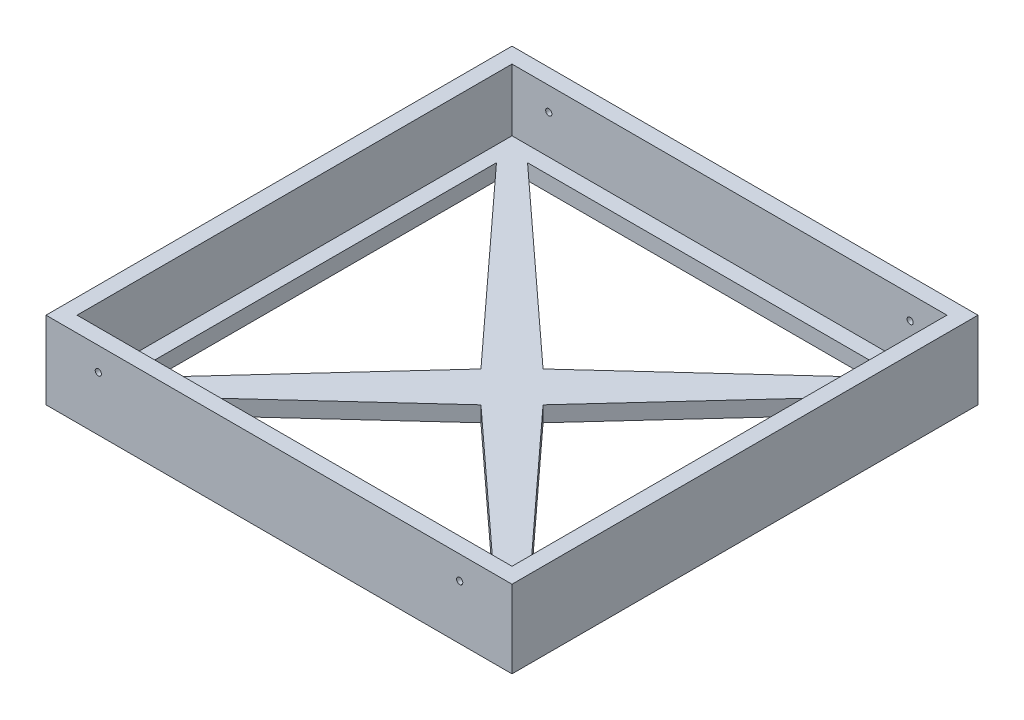
ISO-10303-21;
HEADER;
FILE_DESCRIPTION(('STEP AP214'),'2;1');
FILE_NAME('part.step','',(''),(''),'','','');
FILE_SCHEMA(('AUTOMOTIVE_DESIGN { 1 0 10303 214 1 1 1 1 }'));
ENDSEC;
DATA;
#1=APPLICATION_CONTEXT('core data for automotive mechanical design processes');
#2=APPLICATION_PROTOCOL_DEFINITION('international standard','automotive_design',2000,#1);
#3=PRODUCT_CONTEXT('',#1,'mechanical');
#4=PRODUCT('Part','Part','',(#3));
#5=PRODUCT_RELATED_PRODUCT_CATEGORY('part','',(#4));
#6=PRODUCT_DEFINITION_FORMATION('','',#4);
#7=PRODUCT_DEFINITION_CONTEXT('part definition',#1,'design');
#8=PRODUCT_DEFINITION('design','',#6,#7);
#9=PRODUCT_DEFINITION_SHAPE('','',#8);
#10=(LENGTH_UNIT() NAMED_UNIT(*) SI_UNIT(.MILLI.,.METRE.));
#11=(NAMED_UNIT(*) PLANE_ANGLE_UNIT() SI_UNIT($,.RADIAN.));
#12=(NAMED_UNIT(*) SI_UNIT($,.STERADIAN.) SOLID_ANGLE_UNIT());
#13=UNCERTAINTY_MEASURE_WITH_UNIT(LENGTH_MEASURE(1.E-05),#10,'distance_accuracy_value','');
#14=(GEOMETRIC_REPRESENTATION_CONTEXT(3) GLOBAL_UNCERTAINTY_ASSIGNED_CONTEXT((#13)) GLOBAL_UNIT_ASSIGNED_CONTEXT((#10,
#11,#12)) REPRESENTATION_CONTEXT('',''));
#15=CARTESIAN_POINT('',(0.,0.,0.));
#16=DIRECTION('',(0.,0.,1.));
#17=DIRECTION('',(1.,0.,0.));
#18=AXIS2_PLACEMENT_3D('',#15,#16,#17);
#19=CARTESIAN_POINT('',(-190.5,50.8,190.5));
#20=DIRECTION('',(0.,0.,-1.));
#21=DIRECTION('',(-1.,0.,0.));
#22=AXIS2_PLACEMENT_3D('',#19,#20,#21);
#23=PLANE('',#22);
#24=CARTESIAN_POINT('',(147.717881468527,31.75,190.5));
#25=DIRECTION('',(0.,0.,-1.));
#26=DIRECTION('',(-1.,0.,0.));
#27=AXIS2_PLACEMENT_3D('',#24,#25,#26);
#28=CIRCLE('',#27,2.53999999999998);
#29=CARTESIAN_POINT('',(145.177881468527,31.75,190.5));
#30=VERTEX_POINT('',#29);
#31=EDGE_CURVE('E424',#30,#30,#28,.T.);
#32=ORIENTED_EDGE('',*,*,#31,.T.);
#33=EDGE_LOOP('',(#32));
#34=FACE_BOUND('',#33,.T.);
#35=CARTESIAN_POINT('',(-147.717881468527,31.75,190.5));
#36=DIRECTION('',(0.,0.,1.));
#37=DIRECTION('',(1.,0.,0.));
#38=AXIS2_PLACEMENT_3D('',#35,#36,#37);
#39=CIRCLE('',#38,2.53999999999998);
#40=CARTESIAN_POINT('',(-145.177881468527,31.75,190.5));
#41=VERTEX_POINT('',#40);
#42=EDGE_CURVE('E432',#41,#41,#39,.T.);
#43=ORIENTED_EDGE('',*,*,#42,.F.);
#44=EDGE_LOOP('',(#43));
#45=FACE_BOUND('',#44,.T.);
#46=DIRECTION('',(0.,-1.,0.));
#47=VECTOR('',#46,1.);
#48=CARTESIAN_POINT('',(-190.5,50.8,190.5));
#49=LINE('',#48,#47);
#50=CARTESIAN_POINT('',(-190.5,50.8,190.5));
#51=VERTEX_POINT('',#50);
#52=CARTESIAN_POINT('',(-190.5,-12.7,190.5));
#53=VERTEX_POINT('',#52);
#54=EDGE_CURVE('E514',#51,#53,#49,.T.);
#55=ORIENTED_EDGE('',*,*,#54,.T.);
#56=DIRECTION('',(-1.,0.,0.));
#57=VECTOR('',#56,1.);
#58=CARTESIAN_POINT('',(-190.5,-12.7,190.5));
#59=LINE('',#58,#57);
#60=CARTESIAN_POINT('',(190.5,-12.7,190.5));
#61=VERTEX_POINT('',#60);
#62=EDGE_CURVE('E419',#61,#53,#59,.T.);
#63=ORIENTED_EDGE('',*,*,#62,.F.);
#64=DIRECTION('',(0.,-1.,0.));
#65=VECTOR('',#64,1.);
#66=CARTESIAN_POINT('',(190.5,50.8,190.5));
#67=LINE('',#66,#65);
#68=CARTESIAN_POINT('',(190.5,50.8,190.5));
#69=VERTEX_POINT('',#68);
#70=EDGE_CURVE('E12',#69,#61,#67,.T.);
#71=ORIENTED_EDGE('',*,*,#70,.F.);
#72=DIRECTION('',(1.,0.,0.));
#73=VECTOR('',#72,1.);
#74=CARTESIAN_POINT('',(-190.5,50.8,190.5));
#75=LINE('',#74,#73);
#76=EDGE_CURVE('E489',#51,#69,#75,.T.);
#77=ORIENTED_EDGE('',*,*,#76,.F.);
#78=EDGE_LOOP('',(#55,#63,#71,#77));
#79=FACE_BOUND('',#78,.T.);
#80=ADVANCED_FACE('F138',(#34,#45,#79),#23,.F.);
#81=CARTESIAN_POINT('',(190.5,50.8,-190.5));
#82=DIRECTION('',(1.,0.,0.));
#83=DIRECTION('',(0.,0.,-1.));
#84=AXIS2_PLACEMENT_3D('',#81,#82,#83);
#85=PLANE('',#84);
#86=ORIENTED_EDGE('',*,*,#70,.T.);
#87=DIRECTION('',(0.,0.,1.));
#88=VECTOR('',#87,1.);
#89=CARTESIAN_POINT('',(190.5,-12.7,190.5));
#90=LINE('',#89,#88);
#91=CARTESIAN_POINT('',(190.5,-12.7,-190.5));
#92=VERTEX_POINT('',#91);
#93=EDGE_CURVE('E415',#92,#61,#90,.T.);
#94=ORIENTED_EDGE('',*,*,#93,.F.);
#95=DIRECTION('',(0.,-1.,0.));
#96=VECTOR('',#95,1.);
#97=CARTESIAN_POINT('',(190.5,50.8,-190.5));
#98=LINE('',#97,#96);
#99=CARTESIAN_POINT('',(190.5,50.8,-190.5));
#100=VERTEX_POINT('',#99);
#101=EDGE_CURVE('E146',#100,#92,#98,.T.);
#102=ORIENTED_EDGE('',*,*,#101,.F.);
#103=DIRECTION('',(0.,0.,1.));
#104=VECTOR('',#103,1.);
#105=CARTESIAN_POINT('',(190.5,50.8,-190.5));
#106=LINE('',#105,#104);
#107=EDGE_CURVE('E503',#100,#69,#106,.T.);
#108=ORIENTED_EDGE('',*,*,#107,.T.);
#109=EDGE_LOOP('',(#86,#94,#102,#108));
#110=FACE_BOUND('',#109,.T.);
#111=ADVANCED_FACE('F531',(#110),#85,.T.);
#112=CARTESIAN_POINT('',(-190.5,50.8,-190.5));
#113=DIRECTION('',(0.,0.,-1.));
#114=DIRECTION('',(-1.,0.,0.));
#115=AXIS2_PLACEMENT_3D('',#112,#113,#114);
#116=PLANE('',#115);
#117=CARTESIAN_POINT('',(147.717881468527,31.75,-190.5));
#118=DIRECTION('',(0.,0.,-1.));
#119=DIRECTION('',(-1.,0.,0.));
#120=AXIS2_PLACEMENT_3D('',#117,#118,#119);
#121=CIRCLE('',#120,2.53999999999998);
#122=CARTESIAN_POINT('',(145.177881468527,31.75,-190.5));
#123=VERTEX_POINT('',#122);
#124=EDGE_CURVE('E440',#123,#123,#121,.T.);
#125=ORIENTED_EDGE('',*,*,#124,.F.);
#126=EDGE_LOOP('',(#125));
#127=FACE_BOUND('',#126,.T.);
#128=CARTESIAN_POINT('',(-147.717881468527,31.75,-190.5));
#129=DIRECTION('',(0.,0.,1.));
#130=DIRECTION('',(1.,0.,0.));
#131=AXIS2_PLACEMENT_3D('',#128,#129,#130);
#132=CIRCLE('',#131,2.53999999999998);
#133=CARTESIAN_POINT('',(-145.177881468527,31.75,-190.5));
#134=VERTEX_POINT('',#133);
#135=EDGE_CURVE('E448',#134,#134,#132,.T.);
#136=ORIENTED_EDGE('',*,*,#135,.T.);
#137=EDGE_LOOP('',(#136));
#138=FACE_BOUND('',#137,.T.);
#139=ORIENTED_EDGE('',*,*,#101,.T.);
#140=DIRECTION('',(1.,0.,0.));
#141=VECTOR('',#140,1.);
#142=CARTESIAN_POINT('',(-190.5,-12.7,-190.5));
#143=LINE('',#142,#141);
#144=CARTESIAN_POINT('',(-190.5,-12.7,-190.5));
#145=VERTEX_POINT('',#144);
#146=EDGE_CURVE('E411',#145,#92,#143,.T.);
#147=ORIENTED_EDGE('',*,*,#146,.F.);
#148=DIRECTION('',(0.,-1.,0.));
#149=VECTOR('',#148,1.);
#150=CARTESIAN_POINT('',(-190.5,50.8,-190.5));
#151=LINE('',#150,#149);
#152=CARTESIAN_POINT('',(-190.5,50.8,-190.5));
#153=VERTEX_POINT('',#152);
#154=EDGE_CURVE('E517',#153,#145,#151,.T.);
#155=ORIENTED_EDGE('',*,*,#154,.F.);
#156=DIRECTION('',(1.,0.,0.));
#157=VECTOR('',#156,1.);
#158=CARTESIAN_POINT('',(-190.5,50.8,-190.5));
#159=LINE('',#158,#157);
#160=EDGE_CURVE('E507',#153,#100,#159,.T.);
#161=ORIENTED_EDGE('',*,*,#160,.T.);
#162=EDGE_LOOP('',(#139,#147,#155,#161));
#163=FACE_BOUND('',#162,.T.);
#164=ADVANCED_FACE('F522',(#127,#138,#163),#116,.T.);
#165=CARTESIAN_POINT('',(-190.5,50.8,-190.5));
#166=DIRECTION('',(1.,0.,0.));
#167=DIRECTION('',(0.,0.,-1.));
#168=AXIS2_PLACEMENT_3D('',#165,#166,#167);
#169=PLANE('',#168);
#170=ORIENTED_EDGE('',*,*,#154,.T.);
#171=DIRECTION('',(0.,0.,-1.));
#172=VECTOR('',#171,1.);
#173=CARTESIAN_POINT('',(-190.5,-12.7,190.5));
#174=LINE('',#173,#172);
#175=EDGE_CURVE('E401',#53,#145,#174,.T.);
#176=ORIENTED_EDGE('',*,*,#175,.F.);
#177=ORIENTED_EDGE('',*,*,#54,.F.);
#178=DIRECTION('',(0.,0.,1.));
#179=VECTOR('',#178,1.);
#180=CARTESIAN_POINT('',(-190.5,50.8,-190.5));
#181=LINE('',#180,#179);
#182=EDGE_CURVE('E511',#153,#51,#181,.T.);
#183=ORIENTED_EDGE('',*,*,#182,.F.);
#184=EDGE_LOOP('',(#170,#176,#177,#183));
#185=FACE_BOUND('',#184,.T.);
#186=ADVANCED_FACE('F537',(#185),#169,.F.);
#187=CARTESIAN_POINT('',(0.,50.8,0.));
#188=DIRECTION('',(0.,-1.,0.));
#189=DIRECTION('',(0.,0.,-1.));
#190=AXIS2_PLACEMENT_3D('',#187,#188,#189);
#191=PLANE('',#190);
#192=DIRECTION('',(0.,0.,1.));
#193=VECTOR('',#192,1.);
#194=CARTESIAN_POINT('',(-177.8,50.8,-177.8));
#195=LINE('',#194,#193);
#196=CARTESIAN_POINT('',(-177.8,50.8,-177.8));
#197=VERTEX_POINT('',#196);
#198=CARTESIAN_POINT('',(-177.8,50.8,177.8));
#199=VERTEX_POINT('',#198);
#200=EDGE_CURVE('E469',#197,#199,#195,.T.);
#201=ORIENTED_EDGE('',*,*,#200,.F.);
#202=DIRECTION('',(1.,0.,0.));
#203=VECTOR('',#202,1.);
#204=CARTESIAN_POINT('',(-177.8,50.8,-177.8));
#205=LINE('',#204,#203);
#206=CARTESIAN_POINT('',(177.8,50.8,-177.8));
#207=VERTEX_POINT('',#206);
#208=EDGE_CURVE('E456',#197,#207,#205,.T.);
#209=ORIENTED_EDGE('',*,*,#208,.T.);
#210=DIRECTION('',(0.,0.,1.));
#211=VECTOR('',#210,1.);
#212=CARTESIAN_POINT('',(177.8,50.8,-177.8));
#213=LINE('',#212,#211);
#214=CARTESIAN_POINT('',(177.8,50.8,177.8));
#215=VERTEX_POINT('',#214);
#216=EDGE_CURVE('E460',#207,#215,#213,.T.);
#217=ORIENTED_EDGE('',*,*,#216,.T.);
#218=DIRECTION('',(1.,0.,0.));
#219=VECTOR('',#218,1.);
#220=CARTESIAN_POINT('',(-177.8,50.8,177.8));
#221=LINE('',#220,#219);
#222=EDGE_CURVE('E465',#199,#215,#221,.T.);
#223=ORIENTED_EDGE('',*,*,#222,.F.);
#224=EDGE_LOOP('',(#201,#209,#217,#223));
#225=FACE_BOUND('',#224,.T.);
#226=ORIENTED_EDGE('',*,*,#76,.T.);
#227=ORIENTED_EDGE('',*,*,#107,.F.);
#228=ORIENTED_EDGE('',*,*,#160,.F.);
#229=ORIENTED_EDGE('',*,*,#182,.T.);
#230=EDGE_LOOP('',(#226,#227,#228,#229));
#231=FACE_BOUND('',#230,.T.);
#232=ADVANCED_FACE('F540',(#225,#231),#191,.F.);
#233=CARTESIAN_POINT('',(-177.8,50.8,-177.8));
#234=DIRECTION('',(0.,0.,-1.));
#235=DIRECTION('',(-1.,0.,0.));
#236=AXIS2_PLACEMENT_3D('',#233,#234,#235);
#237=PLANE('',#236);
#238=CARTESIAN_POINT('',(147.717881468527,31.75,-177.8));
#239=DIRECTION('',(0.,0.,-1.));
#240=DIRECTION('',(-1.,0.,0.));
#241=AXIS2_PLACEMENT_3D('',#238,#239,#240);
#242=CIRCLE('',#241,2.53999999999998);
#243=CARTESIAN_POINT('',(145.177881468527,31.75,-177.8));
#244=VERTEX_POINT('',#243);
#245=EDGE_CURVE('E436',#244,#244,#242,.T.);
#246=ORIENTED_EDGE('',*,*,#245,.T.);
#247=EDGE_LOOP('',(#246));
#248=FACE_BOUND('',#247,.T.);
#249=CARTESIAN_POINT('',(-147.717881468527,31.75,-177.8));
#250=DIRECTION('',(0.,0.,1.));
#251=DIRECTION('',(1.,0.,0.));
#252=AXIS2_PLACEMENT_3D('',#249,#250,#251);
#253=CIRCLE('',#252,2.53999999999998);
#254=CARTESIAN_POINT('',(-145.177881468527,31.75,-177.8));
#255=VERTEX_POINT('',#254);
#256=EDGE_CURVE('E444',#255,#255,#253,.T.);
#257=ORIENTED_EDGE('',*,*,#256,.F.);
#258=EDGE_LOOP('',(#257));
#259=FACE_BOUND('',#258,.T.);
#260=DIRECTION('',(1.,0.,0.));
#261=VECTOR('',#260,1.);
#262=CARTESIAN_POINT('',(-177.8,0.,-177.8));
#263=LINE('',#262,#261);
#264=CARTESIAN_POINT('',(-177.8,0.,-177.8));
#265=VERTEX_POINT('',#264);
#266=CARTESIAN_POINT('',(177.8,0.,-177.8));
#267=VERTEX_POINT('',#266);
#268=EDGE_CURVE('E452',#265,#267,#263,.T.);
#269=ORIENTED_EDGE('',*,*,#268,.T.);
#270=DIRECTION('',(0.,-1.,0.));
#271=VECTOR('',#270,1.);
#272=CARTESIAN_POINT('',(177.8,50.8,-177.8));
#273=LINE('',#272,#271);
#274=EDGE_CURVE('E472',#207,#267,#273,.T.);
#275=ORIENTED_EDGE('',*,*,#274,.F.);
#276=ORIENTED_EDGE('',*,*,#208,.F.);
#277=DIRECTION('',(0.,-1.,0.));
#278=VECTOR('',#277,1.);
#279=CARTESIAN_POINT('',(-177.8,50.8,-177.8));
#280=LINE('',#279,#278);
#281=EDGE_CURVE('E485',#197,#265,#280,.T.);
#282=ORIENTED_EDGE('',*,*,#281,.T.);
#283=EDGE_LOOP('',(#269,#275,#276,#282));
#284=FACE_BOUND('',#283,.T.);
#285=ADVANCED_FACE('F542',(#248,#259,#284),#237,.F.);
#286=CARTESIAN_POINT('',(-177.8,50.8,-177.8));
#287=DIRECTION('',(1.,0.,0.));
#288=DIRECTION('',(0.,0.,-1.));
#289=AXIS2_PLACEMENT_3D('',#286,#287,#288);
#290=PLANE('',#289);
#291=DIRECTION('',(0.,0.,1.));
#292=VECTOR('',#291,1.);
#293=CARTESIAN_POINT('',(-177.8,0.,-177.8));
#294=LINE('',#293,#292);
#295=CARTESIAN_POINT('',(-177.8,0.,177.8));
#296=VERTEX_POINT('',#295);
#297=EDGE_CURVE('E461',#265,#296,#294,.T.);
#298=ORIENTED_EDGE('',*,*,#297,.F.);
#299=ORIENTED_EDGE('',*,*,#281,.F.);
#300=ORIENTED_EDGE('',*,*,#200,.T.);
#301=DIRECTION('',(0.,-1.,0.));
#302=VECTOR('',#301,1.);
#303=CARTESIAN_POINT('',(-177.8,50.8,177.8));
#304=LINE('',#303,#302);
#305=EDGE_CURVE('E490',#199,#296,#304,.T.);
#306=ORIENTED_EDGE('',*,*,#305,.T.);
#307=EDGE_LOOP('',(#298,#299,#300,#306));
#308=FACE_BOUND('',#307,.T.);
#309=ADVANCED_FACE('F549',(#308),#290,.T.);
#310=CARTESIAN_POINT('',(-177.8,50.8,177.8));
#311=DIRECTION('',(0.,0.,-1.));
#312=DIRECTION('',(-1.,0.,0.));
#313=AXIS2_PLACEMENT_3D('',#310,#311,#312);
#314=PLANE('',#313);
#315=CARTESIAN_POINT('',(147.717881468527,31.75,177.8));
#316=DIRECTION('',(0.,0.,-1.));
#317=DIRECTION('',(-1.,0.,0.));
#318=AXIS2_PLACEMENT_3D('',#315,#316,#317);
#319=CIRCLE('',#318,2.53999999999998);
#320=CARTESIAN_POINT('',(145.177881468527,31.75,177.8));
#321=VERTEX_POINT('',#320);
#322=EDGE_CURVE('E423',#321,#321,#319,.T.);
#323=ORIENTED_EDGE('',*,*,#322,.F.);
#324=EDGE_LOOP('',(#323));
#325=FACE_BOUND('',#324,.T.);
#326=CARTESIAN_POINT('',(-147.717881468527,31.75,177.8));
#327=DIRECTION('',(0.,0.,1.));
#328=DIRECTION('',(1.,0.,0.));
#329=AXIS2_PLACEMENT_3D('',#326,#327,#328);
#330=CIRCLE('',#329,2.53999999999998);
#331=CARTESIAN_POINT('',(-145.177881468527,31.75,177.8));
#332=VERTEX_POINT('',#331);
#333=EDGE_CURVE('E428',#332,#332,#330,.T.);
#334=ORIENTED_EDGE('',*,*,#333,.T.);
#335=EDGE_LOOP('',(#334));
#336=FACE_BOUND('',#335,.T.);
#337=DIRECTION('',(1.,0.,0.));
#338=VECTOR('',#337,1.);
#339=CARTESIAN_POINT('',(-177.8,0.,177.8));
#340=LINE('',#339,#338);
#341=CARTESIAN_POINT('',(177.8,0.,177.8));
#342=VERTEX_POINT('',#341);
#343=EDGE_CURVE('E480',#296,#342,#340,.T.);
#344=ORIENTED_EDGE('',*,*,#343,.F.);
#345=ORIENTED_EDGE('',*,*,#305,.F.);
#346=ORIENTED_EDGE('',*,*,#222,.T.);
#347=DIRECTION('',(0.,-1.,0.));
#348=VECTOR('',#347,1.);
#349=CARTESIAN_POINT('',(177.8,50.8,177.8));
#350=LINE('',#349,#348);
#351=EDGE_CURVE('E494',#215,#342,#350,.T.);
#352=ORIENTED_EDGE('',*,*,#351,.T.);
#353=EDGE_LOOP('',(#344,#345,#346,#352));
#354=FACE_BOUND('',#353,.T.);
#355=ADVANCED_FACE('F571',(#325,#336,#354),#314,.T.);
#356=CARTESIAN_POINT('',(177.8,50.8,-177.8));
#357=DIRECTION('',(1.,0.,0.));
#358=DIRECTION('',(0.,0.,-1.));
#359=AXIS2_PLACEMENT_3D('',#356,#357,#358);
#360=PLANE('',#359);
#361=DIRECTION('',(0.,0.,1.));
#362=VECTOR('',#361,1.);
#363=CARTESIAN_POINT('',(177.8,0.,-177.8));
#364=LINE('',#363,#362);
#365=EDGE_CURVE('E476',#267,#342,#364,.T.);
#366=ORIENTED_EDGE('',*,*,#365,.T.);
#367=ORIENTED_EDGE('',*,*,#351,.F.);
#368=ORIENTED_EDGE('',*,*,#216,.F.);
#369=ORIENTED_EDGE('',*,*,#274,.T.);
#370=EDGE_LOOP('',(#366,#367,#368,#369));
#371=FACE_BOUND('',#370,.T.);
#372=ADVANCED_FACE('F574',(#371),#360,.F.);
#373=CARTESIAN_POINT('',(-147.717881468527,31.75,-190.5));
#374=DIRECTION('',(0.,0.,1.));
#375=DIRECTION('',(1.,0.,0.));
#376=AXIS2_PLACEMENT_3D('',#373,#374,#375);
#377=CYLINDRICAL_SURFACE('',#376,2.53999999999998);
#378=ORIENTED_EDGE('',*,*,#135,.F.);
#379=EDGE_LOOP('',(#378));
#380=FACE_BOUND('',#379,.T.);
#381=ORIENTED_EDGE('',*,*,#256,.T.);
#382=EDGE_LOOP('',(#381));
#383=FACE_BOUND('',#382,.T.);
#384=ADVANCED_FACE('F588',(#380,#383),#377,.F.);
#385=CARTESIAN_POINT('',(147.717881468527,31.75,-190.5));
#386=DIRECTION('',(0.,0.,1.));
#387=DIRECTION('',(1.,0.,0.));
#388=AXIS2_PLACEMENT_3D('',#385,#386,#387);
#389=CYLINDRICAL_SURFACE('',#388,2.53999999999998);
#390=ORIENTED_EDGE('',*,*,#124,.T.);
#391=EDGE_LOOP('',(#390));
#392=FACE_BOUND('',#391,.T.);
#393=ORIENTED_EDGE('',*,*,#245,.F.);
#394=EDGE_LOOP('',(#393));
#395=FACE_BOUND('',#394,.T.);
#396=ADVANCED_FACE('F567',(#392,#395),#389,.F.);
#397=CARTESIAN_POINT('',(-147.717881468527,31.75,190.5));
#398=DIRECTION('',(0.,0.,-1.));
#399=DIRECTION('',(-1.,0.,0.));
#400=AXIS2_PLACEMENT_3D('',#397,#398,#399);
#401=CYLINDRICAL_SURFACE('',#400,2.53999999999998);
#402=ORIENTED_EDGE('',*,*,#42,.T.);
#403=EDGE_LOOP('',(#402));
#404=FACE_BOUND('',#403,.T.);
#405=ORIENTED_EDGE('',*,*,#333,.F.);
#406=EDGE_LOOP('',(#405));
#407=FACE_BOUND('',#406,.T.);
#408=ADVANCED_FACE('F563',(#404,#407),#401,.F.);
#409=CARTESIAN_POINT('',(147.717881468527,31.75,190.5));
#410=DIRECTION('',(0.,0.,-1.));
#411=DIRECTION('',(-1.,0.,0.));
#412=AXIS2_PLACEMENT_3D('',#409,#410,#411);
#413=CYLINDRICAL_SURFACE('',#412,2.53999999999998);
#414=ORIENTED_EDGE('',*,*,#31,.F.);
#415=EDGE_LOOP('',(#414));
#416=FACE_BOUND('',#415,.T.);
#417=ORIENTED_EDGE('',*,*,#322,.T.);
#418=EDGE_LOOP('',(#417));
#419=FACE_BOUND('',#418,.T.);
#420=ADVANCED_FACE('F566',(#416,#419),#413,.F.);
#421=CARTESIAN_POINT('',(0.,0.,0.));
#422=DIRECTION('',(0.,-1.,0.));
#423=DIRECTION('',(0.,0.,-1.));
#424=AXIS2_PLACEMENT_3D('',#421,#422,#423);
#425=PLANE('',#424);
#426=DIRECTION('',(-0.675724628517344,0.,-0.737154140200744));
#427=VECTOR('',#426,1.);
#428=CARTESIAN_POINT('',(165.1,0.,152.400000000001));
#429=LINE('',#428,#427);
#430=CARTESIAN_POINT('',(165.1,0.,152.400000000001));
#431=VERTEX_POINT('',#430);
#432=CARTESIAN_POINT('',(25.4,0.,0.));
#433=VERTEX_POINT('',#432);
#434=EDGE_CURVE('E329',#431,#433,#429,.T.);
#435=ORIENTED_EDGE('',*,*,#434,.T.);
#436=DIRECTION('',(-0.675724628517349,0.,0.737154140200739));
#437=VECTOR('',#436,1.);
#438=CARTESIAN_POINT('',(165.100000000001,0.,-152.399999999999));
#439=LINE('',#438,#437);
#440=CARTESIAN_POINT('',(165.100000000001,0.,-152.399999999999));
#441=VERTEX_POINT('',#440);
#442=EDGE_CURVE('E153',#441,#433,#439,.T.);
#443=ORIENTED_EDGE('',*,*,#442,.F.);
#444=DIRECTION('',(0.,0.,1.));
#445=VECTOR('',#444,1.);
#446=CARTESIAN_POINT('',(165.100000000001,0.,-152.399999999999));
#447=LINE('',#446,#445);
#448=EDGE_CURVE('E325',#441,#431,#447,.T.);
#449=ORIENTED_EDGE('',*,*,#448,.T.);
#450=EDGE_LOOP('',(#435,#443,#449));
#451=FACE_BOUND('',#450,.T.);
#452=DIRECTION('',(-0.737154140200741,0.,0.675724628517346));
#453=VECTOR('',#452,1.);
#454=CARTESIAN_POINT('',(152.4,0.,-165.1));
#455=LINE('',#454,#453);
#456=CARTESIAN_POINT('',(152.4,0.,-165.1));
#457=VERTEX_POINT('',#456);
#458=CARTESIAN_POINT('',(0.,0.,-25.4));
#459=VERTEX_POINT('',#458);
#460=EDGE_CURVE('E359',#457,#459,#455,.T.);
#461=ORIENTED_EDGE('',*,*,#460,.T.);
#462=DIRECTION('',(0.737154140200741,0.,0.675724628517346));
#463=VECTOR('',#462,1.);
#464=CARTESIAN_POINT('',(-152.4,0.,-165.1));
#465=LINE('',#464,#463);
#466=CARTESIAN_POINT('',(-152.4,0.,-165.1));
#467=VERTEX_POINT('',#466);
#468=EDGE_CURVE('E161',#467,#459,#465,.T.);
#469=ORIENTED_EDGE('',*,*,#468,.F.);
#470=DIRECTION('',(1.,0.,0.));
#471=VECTOR('',#470,1.);
#472=CARTESIAN_POINT('',(-152.4,0.,-165.1));
#473=LINE('',#472,#471);
#474=EDGE_CURVE('E355',#467,#457,#473,.T.);
#475=ORIENTED_EDGE('',*,*,#474,.T.);
#476=EDGE_LOOP('',(#461,#469,#475));
#477=FACE_BOUND('',#476,.T.);
#478=DIRECTION('',(0.737154140200746,0.,-0.675724628517341));
#479=VECTOR('',#478,1.);
#480=CARTESIAN_POINT('',(-152.400000000001,0.,165.099999999999));
#481=LINE('',#480,#479);
#482=CARTESIAN_POINT('',(-152.400000000001,0.,165.099999999999));
#483=VERTEX_POINT('',#482);
#484=CARTESIAN_POINT('',(-1.78676518025611E-13,0.,25.4));
#485=VERTEX_POINT('',#484);
#486=EDGE_CURVE('E297',#483,#485,#481,.T.);
#487=ORIENTED_EDGE('',*,*,#486,.T.);
#488=DIRECTION('',(-0.737154140200737,0.,-0.675724628517351));
#489=VECTOR('',#488,1.);
#490=CARTESIAN_POINT('',(152.399999999999,0.,165.100000000001));
#491=LINE('',#490,#489);
#492=CARTESIAN_POINT('',(152.399999999999,0.,165.100000000001));
#493=VERTEX_POINT('',#492);
#494=EDGE_CURVE('E280',#493,#485,#491,.T.);
#495=ORIENTED_EDGE('',*,*,#494,.F.);
#496=DIRECTION('',(-1.,0.,0.));
#497=VECTOR('',#496,1.);
#498=CARTESIAN_POINT('',(152.399999999999,0.,165.100000000001));
#499=LINE('',#498,#497);
#500=EDGE_CURVE('E291',#493,#483,#499,.T.);
#501=ORIENTED_EDGE('',*,*,#500,.T.);
#502=EDGE_LOOP('',(#487,#495,#501));
#503=FACE_BOUND('',#502,.T.);
#504=DIRECTION('',(0.675724628517338,0.,0.737154140200749));
#505=VECTOR('',#504,1.);
#506=CARTESIAN_POINT('',(-165.099999999998,0.,-152.400000000002));
#507=LINE('',#506,#505);
#508=CARTESIAN_POINT('',(-165.099999999998,0.,-152.400000000002));
#509=VERTEX_POINT('',#508);
#510=CARTESIAN_POINT('',(-25.4,0.,-2.65412691824451E-13));
#511=VERTEX_POINT('',#510);
#512=EDGE_CURVE('E391',#509,#511,#507,.T.);
#513=ORIENTED_EDGE('',*,*,#512,.T.);
#514=DIRECTION('',(0.675724628517354,0.,-0.737154140200734));
#515=VECTOR('',#514,1.);
#516=CARTESIAN_POINT('',(-165.100000000002,0.,152.399999999998));
#517=LINE('',#516,#515);
#518=CARTESIAN_POINT('',(-165.100000000002,0.,152.399999999998));
#519=VERTEX_POINT('',#518);
#520=EDGE_CURVE('E366',#519,#511,#517,.T.);
#521=ORIENTED_EDGE('',*,*,#520,.F.);
#522=DIRECTION('',(0.,0.,-1.));
#523=VECTOR('',#522,1.);
#524=CARTESIAN_POINT('',(-165.100000000002,0.,152.399999999998));
#525=LINE('',#524,#523);
#526=EDGE_CURVE('E381',#519,#509,#525,.T.);
#527=ORIENTED_EDGE('',*,*,#526,.T.);
#528=EDGE_LOOP('',(#513,#521,#527));
#529=FACE_BOUND('',#528,.T.);
#530=ORIENTED_EDGE('',*,*,#268,.F.);
#531=ORIENTED_EDGE('',*,*,#297,.T.);
#532=ORIENTED_EDGE('',*,*,#343,.T.);
#533=ORIENTED_EDGE('',*,*,#365,.F.);
#534=EDGE_LOOP('',(#530,#531,#532,#533));
#535=FACE_BOUND('',#534,.T.);
#536=ADVANCED_FACE('F299',(#451,#477,#503,#529,#535),#425,.F.);
#537=CARTESIAN_POINT('',(0.,-12.7,0.));
#538=DIRECTION('',(0.,-1.,0.));
#539=DIRECTION('',(0.,0.,-1.));
#540=AXIS2_PLACEMENT_3D('',#537,#538,#539);
#541=PLANE('',#540);
#542=DIRECTION('',(-0.675724628517349,0.,0.737154140200739));
#543=VECTOR('',#542,1.);
#544=CARTESIAN_POINT('',(165.100000000001,-12.7,-152.399999999999));
#545=LINE('',#544,#543);
#546=CARTESIAN_POINT('',(165.100000000001,-12.7,-152.399999999999));
#547=VERTEX_POINT('',#546);
#548=CARTESIAN_POINT('',(25.4,-12.7,0.));
#549=VERTEX_POINT('',#548);
#550=EDGE_CURVE('E330',#547,#549,#545,.T.);
#551=ORIENTED_EDGE('',*,*,#550,.T.);
#552=DIRECTION('',(-0.675724628517344,0.,-0.737154140200744));
#553=VECTOR('',#552,1.);
#554=CARTESIAN_POINT('',(165.1,-12.7,152.400000000001));
#555=LINE('',#554,#553);
#556=CARTESIAN_POINT('',(165.1,-12.7,152.400000000001));
#557=VERTEX_POINT('',#556);
#558=EDGE_CURVE('E340',#557,#549,#555,.T.);
#559=ORIENTED_EDGE('',*,*,#558,.F.);
#560=DIRECTION('',(0.,0.,1.));
#561=VECTOR('',#560,1.);
#562=CARTESIAN_POINT('',(165.100000000001,-12.7,-152.399999999999));
#563=LINE('',#562,#561);
#564=EDGE_CURVE('E322',#547,#557,#563,.T.);
#565=ORIENTED_EDGE('',*,*,#564,.F.);
#566=EDGE_LOOP('',(#551,#559,#565));
#567=FACE_BOUND('',#566,.T.);
#568=DIRECTION('',(0.737154140200741,0.,0.675724628517346));
#569=VECTOR('',#568,1.);
#570=CARTESIAN_POINT('',(-152.4,-12.7,-165.1));
#571=LINE('',#570,#569);
#572=CARTESIAN_POINT('',(-152.4,-12.7,-165.1));
#573=VERTEX_POINT('',#572);
#574=CARTESIAN_POINT('',(0.,-12.7,-25.4));
#575=VERTEX_POINT('',#574);
#576=EDGE_CURVE('E360',#573,#575,#571,.T.);
#577=ORIENTED_EDGE('',*,*,#576,.T.);
#578=DIRECTION('',(-0.737154140200741,0.,0.675724628517346));
#579=VECTOR('',#578,1.);
#580=CARTESIAN_POINT('',(152.4,-12.7,-165.1));
#581=LINE('',#580,#579);
#582=CARTESIAN_POINT('',(152.4,-12.7,-165.1));
#583=VERTEX_POINT('',#582);
#584=EDGE_CURVE('E370',#583,#575,#581,.T.);
#585=ORIENTED_EDGE('',*,*,#584,.F.);
#586=DIRECTION('',(1.,0.,0.));
#587=VECTOR('',#586,1.);
#588=CARTESIAN_POINT('',(-152.4,-12.7,-165.1));
#589=LINE('',#588,#587);
#590=EDGE_CURVE('E349',#573,#583,#589,.T.);
#591=ORIENTED_EDGE('',*,*,#590,.F.);
#592=EDGE_LOOP('',(#577,#585,#591));
#593=FACE_BOUND('',#592,.T.);
#594=DIRECTION('',(-0.737154140200737,0.,-0.675724628517351));
#595=VECTOR('',#594,1.);
#596=CARTESIAN_POINT('',(152.399999999999,-12.7,165.100000000001));
#597=LINE('',#596,#595);
#598=CARTESIAN_POINT('',(152.399999999999,-12.7,165.100000000001));
#599=VERTEX_POINT('',#598);
#600=CARTESIAN_POINT('',(-1.77367252013231E-13,-12.7,25.4));
#601=VERTEX_POINT('',#600);
#602=EDGE_CURVE('E283',#599,#601,#597,.T.);
#603=ORIENTED_EDGE('',*,*,#602,.T.);
#604=DIRECTION('',(0.737154140200746,0.,-0.675724628517341));
#605=VECTOR('',#604,1.);
#606=CARTESIAN_POINT('',(-152.400000000001,-12.7,165.099999999999));
#607=LINE('',#606,#605);
#608=CARTESIAN_POINT('',(-152.400000000001,-12.7,165.099999999999));
#609=VERTEX_POINT('',#608);
#610=EDGE_CURVE('E313',#609,#601,#607,.T.);
#611=ORIENTED_EDGE('',*,*,#610,.F.);
#612=DIRECTION('',(-1.,0.,0.));
#613=VECTOR('',#612,1.);
#614=CARTESIAN_POINT('',(152.399999999999,-12.7,165.100000000001));
#615=LINE('',#614,#613);
#616=EDGE_CURVE('E310',#599,#609,#615,.T.);
#617=ORIENTED_EDGE('',*,*,#616,.F.);
#618=EDGE_LOOP('',(#603,#611,#617));
#619=FACE_BOUND('',#618,.T.);
#620=DIRECTION('',(0.675724628517354,0.,-0.737154140200734));
#621=VECTOR('',#620,1.);
#622=CARTESIAN_POINT('',(-165.100000000002,-12.7,152.399999999998));
#623=LINE('',#622,#621);
#624=CARTESIAN_POINT('',(-165.100000000002,-12.7,152.399999999998));
#625=VERTEX_POINT('',#624);
#626=CARTESIAN_POINT('',(-25.4,-12.7,-2.66050878019847E-13));
#627=VERTEX_POINT('',#626);
#628=EDGE_CURVE('E376',#625,#627,#623,.T.);
#629=ORIENTED_EDGE('',*,*,#628,.T.);
#630=DIRECTION('',(0.675724628517338,0.,0.737154140200749));
#631=VECTOR('',#630,1.);
#632=CARTESIAN_POINT('',(-165.099999999998,-12.7,-152.400000000002));
#633=LINE('',#632,#631);
#634=CARTESIAN_POINT('',(-165.099999999998,-12.7,-152.400000000002));
#635=VERTEX_POINT('',#634);
#636=EDGE_CURVE('E380',#635,#627,#633,.T.);
#637=ORIENTED_EDGE('',*,*,#636,.F.);
#638=DIRECTION('',(0.,0.,-1.));
#639=VECTOR('',#638,1.);
#640=CARTESIAN_POINT('',(-165.100000000002,-12.7,152.399999999998));
#641=LINE('',#640,#639);
#642=EDGE_CURVE('E384',#625,#635,#641,.T.);
#643=ORIENTED_EDGE('',*,*,#642,.F.);
#644=EDGE_LOOP('',(#629,#637,#643));
#645=FACE_BOUND('',#644,.T.);
#646=ORIENTED_EDGE('',*,*,#175,.T.);
#647=ORIENTED_EDGE('',*,*,#146,.T.);
#648=ORIENTED_EDGE('',*,*,#93,.T.);
#649=ORIENTED_EDGE('',*,*,#62,.T.);
#650=EDGE_LOOP('',(#646,#647,#648,#649));
#651=FACE_BOUND('',#650,.T.);
#652=ADVANCED_FACE('F528',(#567,#593,#619,#645,#651),#541,.T.);
#653=CARTESIAN_POINT('',(-165.100000000002,-12.7,152.399999999998));
#654=DIRECTION('',(0.737154140200734,0.,0.675724628517354));
#655=DIRECTION('',(0.675724628517354,0.,-0.737154140200734));
#656=AXIS2_PLACEMENT_3D('',#653,#654,#655);
#657=PLANE('',#656);
#658=ORIENTED_EDGE('',*,*,#520,.T.);
#659=DIRECTION('',(0.,1.,0.));
#660=VECTOR('',#659,1.);
#661=CARTESIAN_POINT('',(-25.4,-12.7,-2.66050878019847E-13));
#662=LINE('',#661,#660);
#663=EDGE_CURVE('E388',#627,#511,#662,.T.);
#664=ORIENTED_EDGE('',*,*,#663,.F.);
#665=ORIENTED_EDGE('',*,*,#628,.F.);
#666=DIRECTION('',(0.,1.,0.));
#667=VECTOR('',#666,1.);
#668=CARTESIAN_POINT('',(-165.100000000002,-12.7,152.399999999998));
#669=LINE('',#668,#667);
#670=EDGE_CURVE('E398',#625,#519,#669,.T.);
#671=ORIENTED_EDGE('',*,*,#670,.T.);
#672=EDGE_LOOP('',(#658,#664,#665,#671));
#673=FACE_BOUND('',#672,.T.);
#674=ADVANCED_FACE('F609',(#673),#657,.F.);
#675=CARTESIAN_POINT('',(-165.100000000002,-12.7,152.399999999998));
#676=DIRECTION('',(1.,0.,0.));
#677=DIRECTION('',(0.,0.,-1.));
#678=AXIS2_PLACEMENT_3D('',#675,#676,#677);
#679=PLANE('',#678);
#680=ORIENTED_EDGE('',*,*,#526,.F.);
#681=ORIENTED_EDGE('',*,*,#670,.F.);
#682=ORIENTED_EDGE('',*,*,#642,.T.);
#683=DIRECTION('',(0.,1.,0.));
#684=VECTOR('',#683,1.);
#685=CARTESIAN_POINT('',(-165.099999999998,-12.7,-152.400000000002));
#686=LINE('',#685,#684);
#687=EDGE_CURVE('E402',#635,#509,#686,.T.);
#688=ORIENTED_EDGE('',*,*,#687,.T.);
#689=EDGE_LOOP('',(#680,#681,#682,#688));
#690=FACE_BOUND('',#689,.T.);
#691=ADVANCED_FACE('F613',(#690),#679,.T.);
#692=CARTESIAN_POINT('',(-165.099999999998,-12.7,-152.400000000002));
#693=DIRECTION('',(-0.737154140200749,0.,0.675724628517338));
#694=DIRECTION('',(0.675724628517338,0.,0.737154140200749));
#695=AXIS2_PLACEMENT_3D('',#692,#693,#694);
#696=PLANE('',#695);
#697=ORIENTED_EDGE('',*,*,#512,.F.);
#698=ORIENTED_EDGE('',*,*,#687,.F.);
#699=ORIENTED_EDGE('',*,*,#636,.T.);
#700=ORIENTED_EDGE('',*,*,#663,.T.);
#701=EDGE_LOOP('',(#697,#698,#699,#700));
#702=FACE_BOUND('',#701,.T.);
#703=ADVANCED_FACE('F615',(#702),#696,.T.);
#704=CARTESIAN_POINT('',(152.399999999999,-12.7,165.100000000001));
#705=DIRECTION('',(0.675724628517351,0.,-0.737154140200737));
#706=DIRECTION('',(-0.737154140200737,0.,-0.675724628517351));
#707=AXIS2_PLACEMENT_3D('',#704,#705,#706);
#708=PLANE('',#707);
#709=ORIENTED_EDGE('',*,*,#494,.T.);
#710=DIRECTION('',(0.,1.,0.));
#711=VECTOR('',#710,1.);
#712=CARTESIAN_POINT('',(-1.77367252013231E-13,-12.7,25.4));
#713=LINE('',#712,#711);
#714=EDGE_CURVE('E314',#601,#485,#713,.T.);
#715=ORIENTED_EDGE('',*,*,#714,.F.);
#716=ORIENTED_EDGE('',*,*,#602,.F.);
#717=DIRECTION('',(0.,1.,0.));
#718=VECTOR('',#717,1.);
#719=CARTESIAN_POINT('',(152.399999999999,-12.7,165.100000000001));
#720=LINE('',#719,#718);
#721=EDGE_CURVE('E275',#599,#493,#720,.T.);
#722=ORIENTED_EDGE('',*,*,#721,.T.);
#723=EDGE_LOOP('',(#709,#715,#716,#722));
#724=FACE_BOUND('',#723,.T.);
#725=ADVANCED_FACE('F277',(#724),#708,.F.);
#726=CARTESIAN_POINT('',(152.399999999999,-12.7,165.100000000001));
#727=DIRECTION('',(0.,0.,-1.));
#728=DIRECTION('',(-1.,0.,0.));
#729=AXIS2_PLACEMENT_3D('',#726,#727,#728);
#730=PLANE('',#729);
#731=ORIENTED_EDGE('',*,*,#500,.F.);
#732=ORIENTED_EDGE('',*,*,#721,.F.);
#733=ORIENTED_EDGE('',*,*,#616,.T.);
#734=DIRECTION('',(0.,1.,0.));
#735=VECTOR('',#734,1.);
#736=CARTESIAN_POINT('',(-152.400000000001,-12.7,165.099999999999));
#737=LINE('',#736,#735);
#738=EDGE_CURVE('E288',#609,#483,#737,.T.);
#739=ORIENTED_EDGE('',*,*,#738,.T.);
#740=EDGE_LOOP('',(#731,#732,#733,#739));
#741=FACE_BOUND('',#740,.T.);
#742=ADVANCED_FACE('F292',(#741),#730,.T.);
#743=CARTESIAN_POINT('',(-152.400000000001,-12.7,165.099999999999));
#744=DIRECTION('',(0.675724628517341,0.,0.737154140200746));
#745=DIRECTION('',(0.737154140200746,0.,-0.675724628517341));
#746=AXIS2_PLACEMENT_3D('',#743,#744,#745);
#747=PLANE('',#746);
#748=ORIENTED_EDGE('',*,*,#486,.F.);
#749=ORIENTED_EDGE('',*,*,#738,.F.);
#750=ORIENTED_EDGE('',*,*,#610,.T.);
#751=ORIENTED_EDGE('',*,*,#714,.T.);
#752=EDGE_LOOP('',(#748,#749,#750,#751));
#753=FACE_BOUND('',#752,.T.);
#754=ADVANCED_FACE('F634',(#753),#747,.T.);
#755=CARTESIAN_POINT('',(-152.4,-12.7,-165.1));
#756=DIRECTION('',(-0.675724628517346,0.,0.737154140200741));
#757=DIRECTION('',(0.737154140200742,0.,0.675724628517346));
#758=AXIS2_PLACEMENT_3D('',#755,#756,#757);
#759=PLANE('',#758);
#760=ORIENTED_EDGE('',*,*,#468,.T.);
#761=DIRECTION('',(0.,1.,0.));
#762=VECTOR('',#761,1.);
#763=CARTESIAN_POINT('',(0.,-12.7,-25.4));
#764=LINE('',#763,#762);
#765=EDGE_CURVE('E346',#575,#459,#764,.T.);
#766=ORIENTED_EDGE('',*,*,#765,.F.);
#767=ORIENTED_EDGE('',*,*,#576,.F.);
#768=DIRECTION('',(0.,1.,0.));
#769=VECTOR('',#768,1.);
#770=CARTESIAN_POINT('',(-152.4,-12.7,-165.1));
#771=LINE('',#770,#769);
#772=EDGE_CURVE('E336',#573,#467,#771,.T.);
#773=ORIENTED_EDGE('',*,*,#772,.T.);
#774=EDGE_LOOP('',(#760,#766,#767,#773));
#775=FACE_BOUND('',#774,.T.);
#776=ADVANCED_FACE('F626',(#775),#759,.F.);
#777=CARTESIAN_POINT('',(-152.4,-12.7,-165.1));
#778=DIRECTION('',(0.,0.,1.));
#779=DIRECTION('',(1.,0.,0.));
#780=AXIS2_PLACEMENT_3D('',#777,#778,#779);
#781=PLANE('',#780);
#782=ORIENTED_EDGE('',*,*,#474,.F.);
#783=ORIENTED_EDGE('',*,*,#772,.F.);
#784=ORIENTED_EDGE('',*,*,#590,.T.);
#785=DIRECTION('',(0.,1.,0.));
#786=VECTOR('',#785,1.);
#787=CARTESIAN_POINT('',(152.4,-12.7,-165.1));
#788=LINE('',#787,#786);
#789=EDGE_CURVE('E350',#583,#457,#788,.T.);
#790=ORIENTED_EDGE('',*,*,#789,.T.);
#791=EDGE_LOOP('',(#782,#783,#784,#790));
#792=FACE_BOUND('',#791,.T.);
#793=ADVANCED_FACE('F622',(#792),#781,.T.);
#794=CARTESIAN_POINT('',(152.4,-12.7,-165.1));
#795=DIRECTION('',(-0.675724628517346,0.,-0.737154140200741));
#796=DIRECTION('',(-0.737154140200742,0.,0.675724628517346));
#797=AXIS2_PLACEMENT_3D('',#794,#795,#796);
#798=PLANE('',#797);
#799=ORIENTED_EDGE('',*,*,#460,.F.);
#800=ORIENTED_EDGE('',*,*,#789,.F.);
#801=ORIENTED_EDGE('',*,*,#584,.T.);
#802=ORIENTED_EDGE('',*,*,#765,.T.);
#803=EDGE_LOOP('',(#799,#800,#801,#802));
#804=FACE_BOUND('',#803,.T.);
#805=ADVANCED_FACE('F625',(#804),#798,.T.);
#806=CARTESIAN_POINT('',(165.100000000001,-12.7,-152.399999999999));
#807=DIRECTION('',(-0.737154140200739,0.,-0.675724628517349));
#808=DIRECTION('',(-0.675724628517349,0.,0.737154140200739));
#809=AXIS2_PLACEMENT_3D('',#806,#807,#808);
#810=PLANE('',#809);
#811=ORIENTED_EDGE('',*,*,#442,.T.);
#812=DIRECTION('',(0.,1.,0.));
#813=VECTOR('',#812,1.);
#814=CARTESIAN_POINT('',(25.4,-12.7,0.));
#815=LINE('',#814,#813);
#816=EDGE_CURVE('E319',#549,#433,#815,.T.);
#817=ORIENTED_EDGE('',*,*,#816,.F.);
#818=ORIENTED_EDGE('',*,*,#550,.F.);
#819=DIRECTION('',(0.,1.,0.));
#820=VECTOR('',#819,1.);
#821=CARTESIAN_POINT('',(165.100000000001,-12.7,-152.399999999999));
#822=LINE('',#821,#820);
#823=EDGE_CURVE('E302',#547,#441,#822,.T.);
#824=ORIENTED_EDGE('',*,*,#823,.T.);
#825=EDGE_LOOP('',(#811,#817,#818,#824));
#826=FACE_BOUND('',#825,.T.);
#827=ADVANCED_FACE('F630',(#826),#810,.F.);
#828=CARTESIAN_POINT('',(165.100000000001,-12.7,-152.399999999999));
#829=DIRECTION('',(-1.,0.,0.));
#830=DIRECTION('',(0.,0.,1.));
#831=AXIS2_PLACEMENT_3D('',#828,#829,#830);
#832=PLANE('',#831);
#833=ORIENTED_EDGE('',*,*,#448,.F.);
#834=ORIENTED_EDGE('',*,*,#823,.F.);
#835=ORIENTED_EDGE('',*,*,#564,.T.);
#836=DIRECTION('',(0.,1.,0.));
#837=VECTOR('',#836,1.);
#838=CARTESIAN_POINT('',(165.1,-12.7,152.400000000001));
#839=LINE('',#838,#837);
#840=EDGE_CURVE('E306',#557,#431,#839,.T.);
#841=ORIENTED_EDGE('',*,*,#840,.T.);
#842=EDGE_LOOP('',(#833,#834,#835,#841));
#843=FACE_BOUND('',#842,.T.);
#844=ADVANCED_FACE('F635',(#843),#832,.T.);
#845=CARTESIAN_POINT('',(165.1,-12.7,152.400000000001));
#846=DIRECTION('',(0.737154140200744,0.,-0.675724628517344));
#847=DIRECTION('',(-0.675724628517344,0.,-0.737154140200744));
#848=AXIS2_PLACEMENT_3D('',#845,#846,#847);
#849=PLANE('',#848);
#850=ORIENTED_EDGE('',*,*,#434,.F.);
#851=ORIENTED_EDGE('',*,*,#840,.F.);
#852=ORIENTED_EDGE('',*,*,#558,.T.);
#853=ORIENTED_EDGE('',*,*,#816,.T.);
#854=EDGE_LOOP('',(#850,#851,#852,#853));
#855=FACE_BOUND('',#854,.T.);
#856=ADVANCED_FACE('F638',(#855),#849,.T.);
#857=CLOSED_SHELL('',(#80,#111,#164,#186,#232,#285,#309,#355,#372,#384,#396,#408,#420,#536,#652,
#674,#691,#703,#725,#742,#754,#776,#793,#805,#827,#844,#856));
#858=MANIFOLD_SOLID_BREP('B2',#857);
#859=ADVANCED_BREP_SHAPE_REPRESENTATION('',(#18,#858),#14);
#860=SHAPE_DEFINITION_REPRESENTATION(#9,#859);
ENDSEC;
END-ISO-10303-21;
